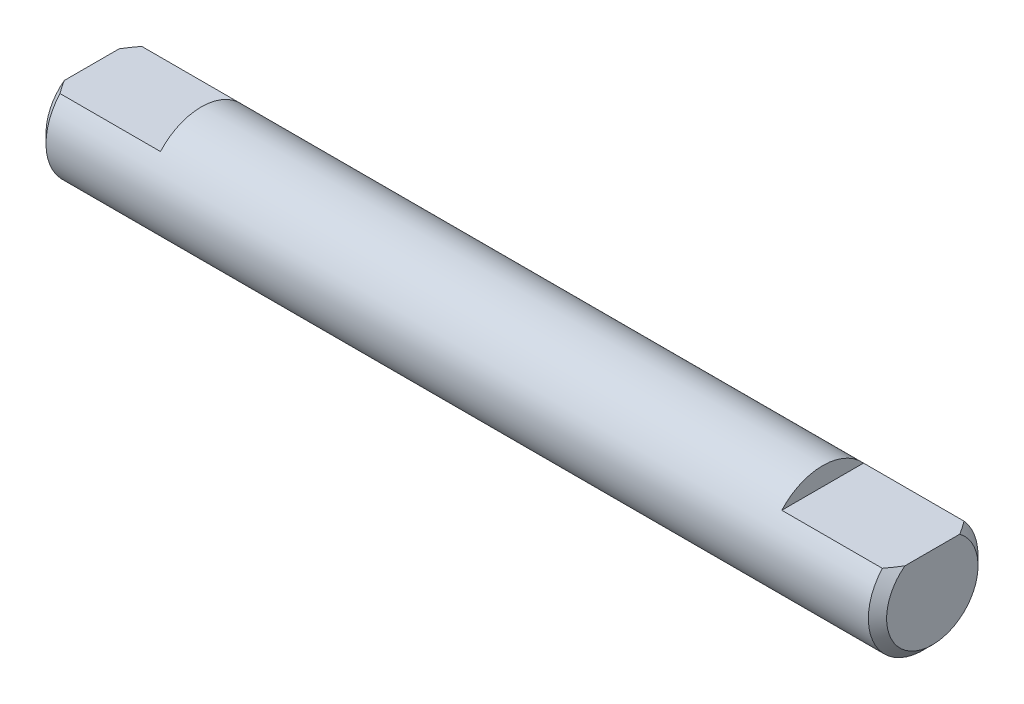
ISO-10303-21;
HEADER;
FILE_DESCRIPTION(('STEP AP214'),'2;1');
FILE_NAME('part.step','',(''),(''),'','','');
FILE_SCHEMA(('AUTOMOTIVE_DESIGN { 1 0 10303 214 1 1 1 1 }'));
ENDSEC;
DATA;
#1=APPLICATION_CONTEXT('core data for automotive mechanical design processes');
#2=APPLICATION_PROTOCOL_DEFINITION('international standard','automotive_design',2000,#1);
#3=PRODUCT_CONTEXT('',#1,'mechanical');
#4=PRODUCT('Part','Part','',(#3));
#5=PRODUCT_RELATED_PRODUCT_CATEGORY('part','',(#4));
#6=PRODUCT_DEFINITION_FORMATION('','',#4);
#7=PRODUCT_DEFINITION_CONTEXT('part definition',#1,'design');
#8=PRODUCT_DEFINITION('design','',#6,#7);
#9=PRODUCT_DEFINITION_SHAPE('','',#8);
#10=(LENGTH_UNIT() NAMED_UNIT(*) SI_UNIT(.MILLI.,.METRE.));
#11=(NAMED_UNIT(*) PLANE_ANGLE_UNIT() SI_UNIT($,.RADIAN.));
#12=(NAMED_UNIT(*) SI_UNIT($,.STERADIAN.) SOLID_ANGLE_UNIT());
#13=UNCERTAINTY_MEASURE_WITH_UNIT(LENGTH_MEASURE(1.E-05),#10,'distance_accuracy_value','');
#14=(GEOMETRIC_REPRESENTATION_CONTEXT(3) GLOBAL_UNCERTAINTY_ASSIGNED_CONTEXT((#13)) GLOBAL_UNIT_ASSIGNED_CONTEXT((#10,
#11,#12)) REPRESENTATION_CONTEXT('',''));
#15=CARTESIAN_POINT('',(0.,0.,0.));
#16=DIRECTION('',(0.,0.,1.));
#17=DIRECTION('',(1.,0.,0.));
#18=AXIS2_PLACEMENT_3D('',#15,#16,#17);
#19=CARTESIAN_POINT('',(23.,0.,0.));
#20=DIRECTION('',(-1.,0.,0.));
#21=DIRECTION('',(0.,0.,1.));
#22=AXIS2_PLACEMENT_3D('',#19,#20,#21);
#23=CYLINDRICAL_SURFACE('',#22,3.);
#24=DIRECTION('',(1.,0.,0.));
#25=VECTOR('',#24,1.);
#26=CARTESIAN_POINT('',(17.,2.,-2.23606797749979));
#27=LINE('',#26,#25);
#28=CARTESIAN_POINT('',(17.,2.,-2.23606797749979));
#29=VERTEX_POINT('',#28);
#30=CARTESIAN_POINT('',(22.5,2.,-2.23606797749979));
#31=VERTEX_POINT('',#30);
#32=EDGE_CURVE('E142',#29,#31,#27,.T.);
#33=ORIENTED_EDGE('',*,*,#32,.T.);
#34=CARTESIAN_POINT('',(22.5,0.,0.));
#35=DIRECTION('',(1.,0.,0.));
#36=DIRECTION('',(0.,0.,-1.));
#37=AXIS2_PLACEMENT_3D('',#34,#35,#36);
#38=CIRCLE('',#37,3.);
#39=CARTESIAN_POINT('',(22.5,2.,2.23606797749979));
#40=VERTEX_POINT('',#39);
#41=EDGE_CURVE('E146',#31,#40,#38,.F.);
#42=ORIENTED_EDGE('',*,*,#41,.T.);
#43=DIRECTION('',(1.,0.,0.));
#44=VECTOR('',#43,1.);
#45=CARTESIAN_POINT('',(17.,2.,2.23606797749979));
#46=LINE('',#45,#44);
#47=CARTESIAN_POINT('',(17.,2.,2.23606797749979));
#48=VERTEX_POINT('',#47);
#49=EDGE_CURVE('E139',#48,#40,#46,.T.);
#50=ORIENTED_EDGE('',*,*,#49,.F.);
#51=CARTESIAN_POINT('',(17.,0.,0.));
#52=DIRECTION('',(1.,0.,0.));
#53=DIRECTION('',(0.,0.,-1.));
#54=AXIS2_PLACEMENT_3D('',#51,#52,#53);
#55=CIRCLE('',#54,3.);
#56=EDGE_CURVE('E132',#29,#48,#55,.T.);
#57=ORIENTED_EDGE('',*,*,#56,.F.);
#58=EDGE_LOOP('',(#33,#42,#50,#57));
#59=FACE_BOUND('',#58,.T.);
#60=DIRECTION('',(-1.,0.,0.));
#61=VECTOR('',#60,1.);
#62=CARTESIAN_POINT('',(-17.,2.,2.23606797749979));
#63=LINE('',#62,#61);
#64=CARTESIAN_POINT('',(-17.,2.,2.23606797749979));
#65=VERTEX_POINT('',#64);
#66=CARTESIAN_POINT('',(-22.5,2.,2.23606797749979));
#67=VERTEX_POINT('',#66);
#68=EDGE_CURVE('E111',#65,#67,#63,.T.);
#69=ORIENTED_EDGE('',*,*,#68,.T.);
#70=CARTESIAN_POINT('',(-22.5,0.,0.));
#71=DIRECTION('',(1.,0.,0.));
#72=DIRECTION('',(0.,0.,-1.));
#73=AXIS2_PLACEMENT_3D('',#70,#71,#72);
#74=CIRCLE('',#73,3.);
#75=CARTESIAN_POINT('',(-22.5,2.,-2.23606797749979));
#76=VERTEX_POINT('',#75);
#77=EDGE_CURVE('E124',#67,#76,#74,.T.);
#78=ORIENTED_EDGE('',*,*,#77,.T.);
#79=DIRECTION('',(-1.,0.,0.));
#80=VECTOR('',#79,1.);
#81=CARTESIAN_POINT('',(-17.,2.,-2.23606797749979));
#82=LINE('',#81,#80);
#83=CARTESIAN_POINT('',(-17.,2.,-2.23606797749979));
#84=VERTEX_POINT('',#83);
#85=EDGE_CURVE('E109',#84,#76,#82,.T.);
#86=ORIENTED_EDGE('',*,*,#85,.F.);
#87=CARTESIAN_POINT('',(-17.,0.,0.));
#88=DIRECTION('',(1.,0.,0.));
#89=DIRECTION('',(0.,0.,-1.));
#90=AXIS2_PLACEMENT_3D('',#87,#88,#89);
#91=CIRCLE('',#90,3.);
#92=EDGE_CURVE('E115',#84,#65,#91,.T.);
#93=ORIENTED_EDGE('',*,*,#92,.T.);
#94=EDGE_LOOP('',(#69,#78,#86,#93));
#95=FACE_BOUND('',#94,.T.);
#96=ADVANCED_FACE('F44',(#59,#95),#23,.T.);
#97=CARTESIAN_POINT('',(-23.,0.,0.));
#98=DIRECTION('',(1.,0.,0.));
#99=DIRECTION('',(0.,0.,-1.));
#100=AXIS2_PLACEMENT_3D('',#97,#98,#99);
#101=PLANE('',#100);
#102=DIRECTION('',(0.,0.,-1.));
#103=VECTOR('',#102,1.);
#104=CARTESIAN_POINT('',(-23.,2.,2.23606797749979));
#105=LINE('',#104,#103);
#106=CARTESIAN_POINT('',(-23.,2.,1.49999999999999));
#107=VERTEX_POINT('',#106);
#108=CARTESIAN_POINT('',(-23.,2.,-1.49999999999999));
#109=VERTEX_POINT('',#108);
#110=EDGE_CURVE('E120',#107,#109,#105,.T.);
#111=ORIENTED_EDGE('',*,*,#110,.T.);
#112=CARTESIAN_POINT('',(-23.,0.,0.));
#113=DIRECTION('',(1.,0.,0.));
#114=DIRECTION('',(0.,0.,-1.));
#115=AXIS2_PLACEMENT_3D('',#112,#113,#114);
#116=CIRCLE('',#115,2.5);
#117=EDGE_CURVE('E202',#109,#107,#116,.F.);
#118=ORIENTED_EDGE('',*,*,#117,.T.);
#119=EDGE_LOOP('',(#111,#118));
#120=FACE_BOUND('',#119,.T.);
#121=ADVANCED_FACE('F181',(#120),#101,.F.);
#122=CARTESIAN_POINT('',(23.,0.,0.));
#123=DIRECTION('',(1.,0.,0.));
#124=DIRECTION('',(0.,0.,-1.));
#125=AXIS2_PLACEMENT_3D('',#122,#123,#124);
#126=PLANE('',#125);
#127=DIRECTION('',(0.,0.,-1.));
#128=VECTOR('',#127,1.);
#129=CARTESIAN_POINT('',(23.,2.,2.23606797749979));
#130=LINE('',#129,#128);
#131=CARTESIAN_POINT('',(23.,2.,1.5));
#132=VERTEX_POINT('',#131);
#133=CARTESIAN_POINT('',(23.,2.,-1.5));
#134=VERTEX_POINT('',#133);
#135=EDGE_CURVE('E128',#132,#134,#130,.T.);
#136=ORIENTED_EDGE('',*,*,#135,.F.);
#137=CARTESIAN_POINT('',(23.,0.,0.));
#138=DIRECTION('',(1.,0.,0.));
#139=DIRECTION('',(0.,0.,-1.));
#140=AXIS2_PLACEMENT_3D('',#137,#138,#139);
#141=CIRCLE('',#140,2.5);
#142=EDGE_CURVE('E200',#132,#134,#141,.T.);
#143=ORIENTED_EDGE('',*,*,#142,.T.);
#144=EDGE_LOOP('',(#136,#143));
#145=FACE_BOUND('',#144,.T.);
#146=ADVANCED_FACE('F185',(#145),#126,.T.);
#147=CARTESIAN_POINT('',(17.,2.,2.23606797749979));
#148=DIRECTION('',(0.,-1.,0.));
#149=DIRECTION('',(0.,0.,-1.));
#150=AXIS2_PLACEMENT_3D('',#147,#148,#149);
#151=PLANE('',#150);
#152=ORIENTED_EDGE('',*,*,#135,.T.);
#153=CARTESIAN_POINT('',(23.,2.,-1.5));
#154=CARTESIAN_POINT('',(22.9617993221427,2.,-1.56363441041136));
#155=CARTESIAN_POINT('',(22.9224920359348,2.,-1.62658889898816));
#156=CARTESIAN_POINT('',(22.8420572974233,2.,-1.75127191097625));
#157=CARTESIAN_POINT('',(22.800930975112,2.,-1.81300116191588));
#158=CARTESIAN_POINT('',(22.7172105304513,2.,-1.93543485253753));
#159=CARTESIAN_POINT('',(22.6746166557635,2.,-1.99613946258492));
#160=CARTESIAN_POINT('',(22.5881782263033,2.,-2.11670900846293));
#161=CARTESIAN_POINT('',(22.5443329228987,2.,-2.17657340830977));
#162=CARTESIAN_POINT('',(22.5,2.,-2.23606797749979));
#163=B_SPLINE_CURVE_WITH_KNOTS('',3,(#153,#154,#155,#156,#157,#158,#159,#160,#161,#162),
.UNSPECIFIED.,.F.,.F.,(4,2,2,2,4),(0.,0.222629901922144,0.445123396049337,0.667579524717565,
0.890171642368371),.UNSPECIFIED.);
#164=EDGE_CURVE('E11',#134,#31,#163,.T.);
#165=ORIENTED_EDGE('',*,*,#164,.T.);
#166=ORIENTED_EDGE('',*,*,#32,.F.);
#167=DIRECTION('',(0.,0.,-1.));
#168=VECTOR('',#167,1.);
#169=CARTESIAN_POINT('',(17.,2.,2.23606797749979));
#170=LINE('',#169,#168);
#171=EDGE_CURVE('E135',#48,#29,#170,.T.);
#172=ORIENTED_EDGE('',*,*,#171,.F.);
#173=ORIENTED_EDGE('',*,*,#49,.T.);
#174=CARTESIAN_POINT('',(22.5,2.,2.23606797749979));
#175=CARTESIAN_POINT('',(22.5443329228987,2.,2.17657340830977));
#176=CARTESIAN_POINT('',(22.5881782263033,2.,2.11670900846293));
#177=CARTESIAN_POINT('',(22.6746166557635,2.,1.99613946258492));
#178=CARTESIAN_POINT('',(22.7172105304513,2.,1.93543485253754));
#179=CARTESIAN_POINT('',(22.800930975112,2.,1.81300116191588));
#180=CARTESIAN_POINT('',(22.8420572974233,2.,1.75127191097625));
#181=CARTESIAN_POINT('',(22.9224920359348,2.,1.62658889898816));
#182=CARTESIAN_POINT('',(22.9617993221427,2.,1.56363441041136));
#183=CARTESIAN_POINT('',(23.,2.,1.50000000000001));
#184=B_SPLINE_CURVE_WITH_KNOTS('',3,(#174,#175,#176,#177,#178,#179,#180,#181,#182,#183),
.UNSPECIFIED.,.F.,.F.,(4,2,2,2,4),(0.,0.222592117650805,0.445048246319033,0.667541740446226,
0.89017164236837),.UNSPECIFIED.);
#185=EDGE_CURVE('E60',#40,#132,#184,.T.);
#186=ORIENTED_EDGE('',*,*,#185,.T.);
#187=EDGE_LOOP('',(#152,#165,#166,#172,#173,#186));
#188=FACE_BOUND('',#187,.T.);
#189=ADVANCED_FACE('F188',(#188),#151,.F.);
#190=CARTESIAN_POINT('',(17.,0.,0.));
#191=DIRECTION('',(1.,0.,0.));
#192=DIRECTION('',(0.,0.,-1.));
#193=AXIS2_PLACEMENT_3D('',#190,#191,#192);
#194=PLANE('',#193);
#195=ORIENTED_EDGE('',*,*,#56,.T.);
#196=ORIENTED_EDGE('',*,*,#171,.T.);
#197=EDGE_LOOP('',(#195,#196));
#198=FACE_BOUND('',#197,.T.);
#199=ADVANCED_FACE('F192',(#198),#194,.T.);
#200=CARTESIAN_POINT('',(-17.,2.,2.23606797749979));
#201=DIRECTION('',(0.,1.,0.));
#202=DIRECTION('',(0.,0.,1.));
#203=AXIS2_PLACEMENT_3D('',#200,#201,#202);
#204=PLANE('',#203);
#205=ORIENTED_EDGE('',*,*,#85,.T.);
#206=CARTESIAN_POINT('',(-22.5,2.,-2.23606797749979));
#207=CARTESIAN_POINT('',(-22.5443329228987,2.,-2.17657340830977));
#208=CARTESIAN_POINT('',(-22.5881782263033,2.,-2.11670900846293));
#209=CARTESIAN_POINT('',(-22.6746166557635,2.,-1.99613946258492));
#210=CARTESIAN_POINT('',(-22.7172105304513,2.,-1.93543485253753));
#211=CARTESIAN_POINT('',(-22.800930975112,2.,-1.81300116191587));
#212=CARTESIAN_POINT('',(-22.8420572974233,2.,-1.75127191097625));
#213=CARTESIAN_POINT('',(-22.9224920359348,2.,-1.62658889898815));
#214=CARTESIAN_POINT('',(-22.9617993221427,2.,-1.56363441041135));
#215=CARTESIAN_POINT('',(-23.,2.,-1.49999999999999));
#216=B_SPLINE_CURVE_WITH_KNOTS('',3,(#206,#207,#208,#209,#210,#211,#212,#213,#214,#215),
.UNSPECIFIED.,.F.,.F.,(4,2,2,2,4),(0.,0.222592117650808,0.445048246319037,0.667541740446233,
0.890171642368379),.UNSPECIFIED.);
#217=EDGE_CURVE('E161',#76,#109,#216,.T.);
#218=ORIENTED_EDGE('',*,*,#217,.T.);
#219=ORIENTED_EDGE('',*,*,#110,.F.);
#220=CARTESIAN_POINT('',(-23.,2.,1.49999999999999));
#221=CARTESIAN_POINT('',(-22.9617993221427,2.,1.56363441041135));
#222=CARTESIAN_POINT('',(-22.9224920359348,2.,1.62658889898815));
#223=CARTESIAN_POINT('',(-22.8420572974233,2.,1.75127191097625));
#224=CARTESIAN_POINT('',(-22.800930975112,2.,1.81300116191587));
#225=CARTESIAN_POINT('',(-22.7172105304513,2.,1.93543485253753));
#226=CARTESIAN_POINT('',(-22.6746166557635,2.,1.99613946258492));
#227=CARTESIAN_POINT('',(-22.5881782263033,2.,2.11670900846293));
#228=CARTESIAN_POINT('',(-22.5443329228987,2.,2.17657340830977));
#229=CARTESIAN_POINT('',(-22.5,2.,2.23606797749979));
#230=B_SPLINE_CURVE_WITH_KNOTS('',3,(#220,#221,#222,#223,#224,#225,#226,#227,#228,#229),
.UNSPECIFIED.,.F.,.F.,(4,2,2,2,4),(0.,0.222629901922146,0.445123396049342,0.667579524717572,
0.89017164236838),.UNSPECIFIED.);
#231=EDGE_CURVE('E153',#107,#67,#230,.T.);
#232=ORIENTED_EDGE('',*,*,#231,.T.);
#233=ORIENTED_EDGE('',*,*,#68,.F.);
#234=DIRECTION('',(0.,0.,-1.));
#235=VECTOR('',#234,1.);
#236=CARTESIAN_POINT('',(-17.,2.,2.23606797749979));
#237=LINE('',#236,#235);
#238=EDGE_CURVE('E105',#65,#84,#237,.T.);
#239=ORIENTED_EDGE('',*,*,#238,.T.);
#240=EDGE_LOOP('',(#205,#218,#219,#232,#233,#239));
#241=FACE_BOUND('',#240,.T.);
#242=ADVANCED_FACE('F107',(#241),#204,.T.);
#243=CARTESIAN_POINT('',(-17.,0.,0.));
#244=DIRECTION('',(-1.,0.,0.));
#245=DIRECTION('',(0.,0.,-1.));
#246=AXIS2_PLACEMENT_3D('',#243,#244,#245);
#247=PLANE('',#246);
#248=ORIENTED_EDGE('',*,*,#92,.F.);
#249=ORIENTED_EDGE('',*,*,#238,.F.);
#250=EDGE_LOOP('',(#248,#249));
#251=FACE_BOUND('',#250,.T.);
#252=ADVANCED_FACE('F117',(#251),#247,.T.);
#253=CARTESIAN_POINT('',(-22.5,0.,0.));
#254=DIRECTION('',(1.,0.,0.));
#255=DIRECTION('',(0.,0.,-1.));
#256=AXIS2_PLACEMENT_3D('',#253,#254,#255);
#257=CONICAL_SURFACE('',#256,3.,0.785398163397453);
#258=ORIENTED_EDGE('',*,*,#231,.F.);
#259=ORIENTED_EDGE('',*,*,#117,.F.);
#260=ORIENTED_EDGE('',*,*,#217,.F.);
#261=ORIENTED_EDGE('',*,*,#77,.F.);
#262=EDGE_LOOP('',(#258,#259,#260,#261));
#263=FACE_BOUND('',#262,.T.);
#264=ADVANCED_FACE('F171',(#263),#257,.T.);
#265=CARTESIAN_POINT('',(23.,0.,0.));
#266=DIRECTION('',(-1.,0.,0.));
#267=DIRECTION('',(0.,0.,1.));
#268=AXIS2_PLACEMENT_3D('',#265,#266,#267);
#269=CONICAL_SURFACE('',#268,2.5,0.785398163397446);
#270=ORIENTED_EDGE('',*,*,#185,.F.);
#271=ORIENTED_EDGE('',*,*,#41,.F.);
#272=ORIENTED_EDGE('',*,*,#164,.F.);
#273=ORIENTED_EDGE('',*,*,#142,.F.);
#274=EDGE_LOOP('',(#270,#271,#272,#273));
#275=FACE_BOUND('',#274,.T.);
#276=ADVANCED_FACE('F47',(#275),#269,.T.);
#277=CLOSED_SHELL('',(#96,#121,#146,#189,#199,#242,#252,#264,#276));
#278=MANIFOLD_SOLID_BREP('B2',#277);
#279=ADVANCED_BREP_SHAPE_REPRESENTATION('',(#18,#278),#14);
#280=SHAPE_DEFINITION_REPRESENTATION(#9,#279);
ENDSEC;
END-ISO-10303-21;
